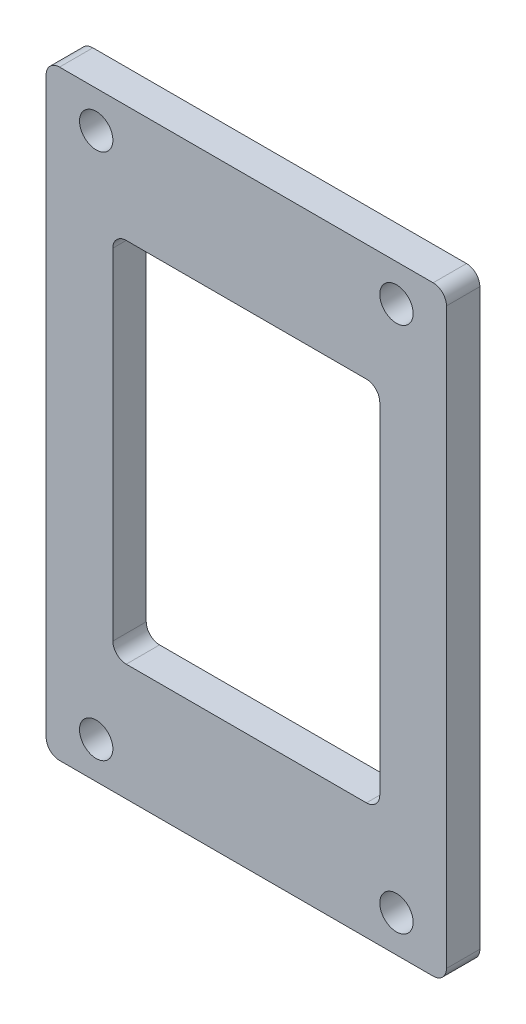
ISO-10303-21;
HEADER;
FILE_DESCRIPTION(('STEP AP214'),'2;1');
FILE_NAME('part.step','',(''),(''),'','','');
FILE_SCHEMA(('AUTOMOTIVE_DESIGN { 1 0 10303 214 1 1 1 1 }'));
ENDSEC;
DATA;
#1=APPLICATION_CONTEXT('core data for automotive mechanical design processes');
#2=APPLICATION_PROTOCOL_DEFINITION('international standard','automotive_design',2000,#1);
#3=PRODUCT_CONTEXT('',#1,'mechanical');
#4=PRODUCT('Part','Part','',(#3));
#5=PRODUCT_RELATED_PRODUCT_CATEGORY('part','',(#4));
#6=PRODUCT_DEFINITION_FORMATION('','',#4);
#7=PRODUCT_DEFINITION_CONTEXT('part definition',#1,'design');
#8=PRODUCT_DEFINITION('design','',#6,#7);
#9=PRODUCT_DEFINITION_SHAPE('','',#8);
#10=(LENGTH_UNIT() NAMED_UNIT(*) SI_UNIT(.MILLI.,.METRE.));
#11=(NAMED_UNIT(*) PLANE_ANGLE_UNIT() SI_UNIT($,.RADIAN.));
#12=(NAMED_UNIT(*) SI_UNIT($,.STERADIAN.) SOLID_ANGLE_UNIT());
#13=UNCERTAINTY_MEASURE_WITH_UNIT(LENGTH_MEASURE(1.E-05),#10,'distance_accuracy_value','');
#14=(GEOMETRIC_REPRESENTATION_CONTEXT(3) GLOBAL_UNCERTAINTY_ASSIGNED_CONTEXT((#13)) GLOBAL_UNIT_ASSIGNED_CONTEXT((#10,
#11,#12)) REPRESENTATION_CONTEXT('',''));
#15=CARTESIAN_POINT('',(0.,0.,0.));
#16=DIRECTION('',(0.,0.,1.));
#17=DIRECTION('',(1.,0.,0.));
#18=AXIS2_PLACEMENT_3D('',#15,#16,#17);
#19=CARTESIAN_POINT('',(-28.,-43.,5.));
#20=DIRECTION('',(0.,0.,-1.));
#21=DIRECTION('',(-1.,0.,0.));
#22=AXIS2_PLACEMENT_3D('',#19,#20,#21);
#23=CYLINDRICAL_SURFACE('',#22,2.);
#24=CARTESIAN_POINT('',(-28.,-43.,0.));
#25=DIRECTION('',(0.,0.,1.));
#26=DIRECTION('',(-1.,0.,0.));
#27=AXIS2_PLACEMENT_3D('',#24,#25,#26);
#28=CIRCLE('',#27,2.);
#29=CARTESIAN_POINT('',(-30.,-43.,0.));
#30=VERTEX_POINT('',#29);
#31=CARTESIAN_POINT('',(-28.,-45.,0.));
#32=VERTEX_POINT('',#31);
#33=EDGE_CURVE('E231',#30,#32,#28,.T.);
#34=ORIENTED_EDGE('',*,*,#33,.T.);
#35=DIRECTION('',(0.,0.,-1.));
#36=VECTOR('',#35,1.);
#37=CARTESIAN_POINT('',(-28.,-45.,5.));
#38=LINE('',#37,#36);
#39=CARTESIAN_POINT('',(-28.,-45.,5.));
#40=VERTEX_POINT('',#39);
#41=EDGE_CURVE('E11',#40,#32,#38,.T.);
#42=ORIENTED_EDGE('',*,*,#41,.F.);
#43=CARTESIAN_POINT('',(-28.,-43.,5.));
#44=DIRECTION('',(0.,0.,1.));
#45=DIRECTION('',(-1.,0.,0.));
#46=AXIS2_PLACEMENT_3D('',#43,#44,#45);
#47=CIRCLE('',#46,2.);
#48=CARTESIAN_POINT('',(-30.,-43.,5.));
#49=VERTEX_POINT('',#48);
#50=EDGE_CURVE('E249',#49,#40,#47,.T.);
#51=ORIENTED_EDGE('',*,*,#50,.F.);
#52=DIRECTION('',(0.,0.,-1.));
#53=VECTOR('',#52,1.);
#54=CARTESIAN_POINT('',(-30.,-43.,5.));
#55=LINE('',#54,#53);
#56=EDGE_CURVE('E275',#49,#30,#55,.T.);
#57=ORIENTED_EDGE('',*,*,#56,.T.);
#58=EDGE_LOOP('',(#34,#42,#51,#57));
#59=FACE_BOUND('',#58,.T.);
#60=ADVANCED_FACE('F39',(#59),#23,.T.);
#61=CARTESIAN_POINT('',(28.,-45.,5.));
#62=DIRECTION('',(0.,1.,0.));
#63=DIRECTION('',(-1.,0.,0.));
#64=AXIS2_PLACEMENT_3D('',#61,#62,#63);
#65=PLANE('',#64);
#66=DIRECTION('',(1.,0.,0.));
#67=VECTOR('',#66,1.);
#68=CARTESIAN_POINT('',(28.,-45.,0.));
#69=LINE('',#68,#67);
#70=CARTESIAN_POINT('',(28.,-45.,0.));
#71=VERTEX_POINT('',#70);
#72=EDGE_CURVE('E279',#32,#71,#69,.T.);
#73=ORIENTED_EDGE('',*,*,#72,.T.);
#74=DIRECTION('',(0.,0.,-1.));
#75=VECTOR('',#74,1.);
#76=CARTESIAN_POINT('',(28.,-45.,5.));
#77=LINE('',#76,#75);
#78=CARTESIAN_POINT('',(28.,-45.,5.));
#79=VERTEX_POINT('',#78);
#80=EDGE_CURVE('E47',#79,#71,#77,.T.);
#81=ORIENTED_EDGE('',*,*,#80,.F.);
#82=DIRECTION('',(1.,0.,0.));
#83=VECTOR('',#82,1.);
#84=CARTESIAN_POINT('',(28.,-45.,5.));
#85=LINE('',#84,#83);
#86=EDGE_CURVE('E253',#40,#79,#85,.T.);
#87=ORIENTED_EDGE('',*,*,#86,.F.);
#88=ORIENTED_EDGE('',*,*,#41,.T.);
#89=EDGE_LOOP('',(#73,#81,#87,#88));
#90=FACE_BOUND('',#89,.T.);
#91=ADVANCED_FACE('F348',(#90),#65,.F.);
#92=CARTESIAN_POINT('',(28.,-43.,5.));
#93=DIRECTION('',(0.,0.,-1.));
#94=DIRECTION('',(-1.,0.,0.));
#95=AXIS2_PLACEMENT_3D('',#92,#93,#94);
#96=CYLINDRICAL_SURFACE('',#95,2.00000000000001);
#97=CARTESIAN_POINT('',(28.,-43.,0.));
#98=DIRECTION('',(0.,0.,1.));
#99=DIRECTION('',(1.,0.,0.));
#100=AXIS2_PLACEMENT_3D('',#97,#98,#99);
#101=CIRCLE('',#100,2.00000000000001);
#102=CARTESIAN_POINT('',(30.,-43.,0.));
#103=VERTEX_POINT('',#102);
#104=EDGE_CURVE('E282',#71,#103,#101,.T.);
#105=ORIENTED_EDGE('',*,*,#104,.T.);
#106=DIRECTION('',(0.,0.,-1.));
#107=VECTOR('',#106,1.);
#108=CARTESIAN_POINT('',(30.,-43.,5.));
#109=LINE('',#108,#107);
#110=CARTESIAN_POINT('',(30.,-43.,5.));
#111=VERTEX_POINT('',#110);
#112=EDGE_CURVE('E318',#111,#103,#109,.T.);
#113=ORIENTED_EDGE('',*,*,#112,.F.);
#114=CARTESIAN_POINT('',(28.,-43.,5.));
#115=DIRECTION('',(0.,0.,1.));
#116=DIRECTION('',(1.,0.,0.));
#117=AXIS2_PLACEMENT_3D('',#114,#115,#116);
#118=CIRCLE('',#117,2.00000000000001);
#119=EDGE_CURVE('E257',#79,#111,#118,.T.);
#120=ORIENTED_EDGE('',*,*,#119,.F.);
#121=ORIENTED_EDGE('',*,*,#80,.T.);
#122=EDGE_LOOP('',(#105,#113,#120,#121));
#123=FACE_BOUND('',#122,.T.);
#124=ADVANCED_FACE('F327',(#123),#96,.T.);
#125=CARTESIAN_POINT('',(30.,-43.,5.));
#126=DIRECTION('',(-1.,0.,0.));
#127=DIRECTION('',(0.,-1.,0.));
#128=AXIS2_PLACEMENT_3D('',#125,#126,#127);
#129=PLANE('',#128);
#130=DIRECTION('',(0.,1.,0.));
#131=VECTOR('',#130,1.);
#132=CARTESIAN_POINT('',(30.,-43.,0.));
#133=LINE('',#132,#131);
#134=CARTESIAN_POINT('',(30.,43.,0.));
#135=VERTEX_POINT('',#134);
#136=EDGE_CURVE('E285',#103,#135,#133,.T.);
#137=ORIENTED_EDGE('',*,*,#136,.T.);
#138=DIRECTION('',(0.,0.,-1.));
#139=VECTOR('',#138,1.);
#140=CARTESIAN_POINT('',(30.,43.,5.));
#141=LINE('',#140,#139);
#142=CARTESIAN_POINT('',(30.,43.,5.));
#143=VERTEX_POINT('',#142);
#144=EDGE_CURVE('E314',#143,#135,#141,.T.);
#145=ORIENTED_EDGE('',*,*,#144,.F.);
#146=DIRECTION('',(0.,1.,0.));
#147=VECTOR('',#146,1.);
#148=CARTESIAN_POINT('',(30.,-43.,5.));
#149=LINE('',#148,#147);
#150=EDGE_CURVE('E260',#111,#143,#149,.T.);
#151=ORIENTED_EDGE('',*,*,#150,.F.);
#152=ORIENTED_EDGE('',*,*,#112,.T.);
#153=EDGE_LOOP('',(#137,#145,#151,#152));
#154=FACE_BOUND('',#153,.T.);
#155=ADVANCED_FACE('F338',(#154),#129,.F.);
#156=CARTESIAN_POINT('',(28.,43.,5.));
#157=DIRECTION('',(0.,0.,-1.));
#158=DIRECTION('',(-1.,0.,0.));
#159=AXIS2_PLACEMENT_3D('',#156,#157,#158);
#160=CYLINDRICAL_SURFACE('',#159,2.);
#161=CARTESIAN_POINT('',(28.,43.,0.));
#162=DIRECTION('',(0.,0.,1.));
#163=DIRECTION('',(1.,0.,0.));
#164=AXIS2_PLACEMENT_3D('',#161,#162,#163);
#165=CIRCLE('',#164,2.);
#166=CARTESIAN_POINT('',(28.,45.,0.));
#167=VERTEX_POINT('',#166);
#168=EDGE_CURVE('E288',#135,#167,#165,.T.);
#169=ORIENTED_EDGE('',*,*,#168,.T.);
#170=DIRECTION('',(0.,0.,-1.));
#171=VECTOR('',#170,1.);
#172=CARTESIAN_POINT('',(28.,45.,5.));
#173=LINE('',#172,#171);
#174=CARTESIAN_POINT('',(28.,45.,5.));
#175=VERTEX_POINT('',#174);
#176=EDGE_CURVE('E310',#175,#167,#173,.T.);
#177=ORIENTED_EDGE('',*,*,#176,.F.);
#178=CARTESIAN_POINT('',(28.,43.,5.));
#179=DIRECTION('',(0.,0.,1.));
#180=DIRECTION('',(1.,0.,0.));
#181=AXIS2_PLACEMENT_3D('',#178,#179,#180);
#182=CIRCLE('',#181,2.);
#183=EDGE_CURVE('E263',#143,#175,#182,.T.);
#184=ORIENTED_EDGE('',*,*,#183,.F.);
#185=ORIENTED_EDGE('',*,*,#144,.T.);
#186=EDGE_LOOP('',(#169,#177,#184,#185));
#187=FACE_BOUND('',#186,.T.);
#188=ADVANCED_FACE('F342',(#187),#160,.T.);
#189=CARTESIAN_POINT('',(28.,45.,5.));
#190=DIRECTION('',(0.,-1.,0.));
#191=DIRECTION('',(1.,0.,0.));
#192=AXIS2_PLACEMENT_3D('',#189,#190,#191);
#193=PLANE('',#192);
#194=DIRECTION('',(-1.,0.,0.));
#195=VECTOR('',#194,1.);
#196=CARTESIAN_POINT('',(28.,45.,0.));
#197=LINE('',#196,#195);
#198=CARTESIAN_POINT('',(-28.,45.,0.));
#199=VERTEX_POINT('',#198);
#200=EDGE_CURVE('E291',#167,#199,#197,.T.);
#201=ORIENTED_EDGE('',*,*,#200,.T.);
#202=DIRECTION('',(0.,0.,-1.));
#203=VECTOR('',#202,1.);
#204=CARTESIAN_POINT('',(-28.,45.,5.));
#205=LINE('',#204,#203);
#206=CARTESIAN_POINT('',(-28.,45.,5.));
#207=VERTEX_POINT('',#206);
#208=EDGE_CURVE('E306',#207,#199,#205,.T.);
#209=ORIENTED_EDGE('',*,*,#208,.F.);
#210=DIRECTION('',(-1.,0.,0.));
#211=VECTOR('',#210,1.);
#212=CARTESIAN_POINT('',(28.,45.,5.));
#213=LINE('',#212,#211);
#214=EDGE_CURVE('E266',#175,#207,#213,.T.);
#215=ORIENTED_EDGE('',*,*,#214,.F.);
#216=ORIENTED_EDGE('',*,*,#176,.T.);
#217=EDGE_LOOP('',(#201,#209,#215,#216));
#218=FACE_BOUND('',#217,.T.);
#219=ADVANCED_FACE('F361',(#218),#193,.F.);
#220=CARTESIAN_POINT('',(-28.,43.,5.));
#221=DIRECTION('',(0.,0.,-1.));
#222=DIRECTION('',(-1.,0.,0.));
#223=AXIS2_PLACEMENT_3D('',#220,#221,#222);
#224=CYLINDRICAL_SURFACE('',#223,1.99999999999999);
#225=CARTESIAN_POINT('',(-28.,43.,0.));
#226=DIRECTION('',(0.,0.,1.));
#227=DIRECTION('',(1.,0.,0.));
#228=AXIS2_PLACEMENT_3D('',#225,#226,#227);
#229=CIRCLE('',#228,1.99999999999999);
#230=CARTESIAN_POINT('',(-30.,43.,0.));
#231=VERTEX_POINT('',#230);
#232=EDGE_CURVE('E294',#199,#231,#229,.T.);
#233=ORIENTED_EDGE('',*,*,#232,.T.);
#234=DIRECTION('',(0.,0.,-1.));
#235=VECTOR('',#234,1.);
#236=CARTESIAN_POINT('',(-30.,43.,5.));
#237=LINE('',#236,#235);
#238=CARTESIAN_POINT('',(-30.,43.,5.));
#239=VERTEX_POINT('',#238);
#240=EDGE_CURVE('E302',#239,#231,#237,.T.);
#241=ORIENTED_EDGE('',*,*,#240,.F.);
#242=CARTESIAN_POINT('',(-28.,43.,5.));
#243=DIRECTION('',(0.,0.,1.));
#244=DIRECTION('',(1.,0.,0.));
#245=AXIS2_PLACEMENT_3D('',#242,#243,#244);
#246=CIRCLE('',#245,1.99999999999999);
#247=EDGE_CURVE('E269',#207,#239,#246,.T.);
#248=ORIENTED_EDGE('',*,*,#247,.F.);
#249=ORIENTED_EDGE('',*,*,#208,.T.);
#250=EDGE_LOOP('',(#233,#241,#248,#249));
#251=FACE_BOUND('',#250,.T.);
#252=ADVANCED_FACE('F359',(#251),#224,.T.);
#253=CARTESIAN_POINT('',(-30.,-43.,5.));
#254=DIRECTION('',(1.,0.,0.));
#255=DIRECTION('',(0.,1.,0.));
#256=AXIS2_PLACEMENT_3D('',#253,#254,#255);
#257=PLANE('',#256);
#258=DIRECTION('',(0.,-1.,0.));
#259=VECTOR('',#258,1.);
#260=CARTESIAN_POINT('',(-30.,-43.,0.));
#261=LINE('',#260,#259);
#262=EDGE_CURVE('E254',#231,#30,#261,.T.);
#263=ORIENTED_EDGE('',*,*,#262,.T.);
#264=ORIENTED_EDGE('',*,*,#56,.F.);
#265=DIRECTION('',(0.,-1.,0.));
#266=VECTOR('',#265,1.);
#267=CARTESIAN_POINT('',(-30.,-43.,5.));
#268=LINE('',#267,#266);
#269=EDGE_CURVE('E272',#239,#49,#268,.T.);
#270=ORIENTED_EDGE('',*,*,#269,.F.);
#271=ORIENTED_EDGE('',*,*,#240,.T.);
#272=EDGE_LOOP('',(#263,#264,#270,#271));
#273=FACE_BOUND('',#272,.T.);
#274=ADVANCED_FACE('F354',(#273),#257,.F.);
#275=CARTESIAN_POINT('',(-28.,-43.,5.));
#276=DIRECTION('',(0.,0.,-1.));
#277=DIRECTION('',(-1.,0.,0.));
#278=AXIS2_PLACEMENT_3D('',#275,#276,#277);
#279=PLANE('',#278);
#280=CARTESIAN_POINT('',(22.5000000000001,-39.5,5.));
#281=DIRECTION('',(0.,0.,1.));
#282=DIRECTION('',(1.,0.,0.));
#283=AXIS2_PLACEMENT_3D('',#280,#281,#282);
#284=CIRCLE('',#283,2.5);
#285=CARTESIAN_POINT('',(25.0000000000001,-39.5,5.));
#286=VERTEX_POINT('',#285);
#287=EDGE_CURVE('E549',#286,#286,#284,.T.);
#288=ORIENTED_EDGE('',*,*,#287,.F.);
#289=EDGE_LOOP('',(#288));
#290=FACE_BOUND('',#289,.T.);
#291=CARTESIAN_POINT('',(-22.5,39.5000000000002,5.));
#292=DIRECTION('',(0.,0.,1.));
#293=DIRECTION('',(1.,0.,0.));
#294=AXIS2_PLACEMENT_3D('',#291,#292,#293);
#295=CIRCLE('',#294,2.5);
#296=CARTESIAN_POINT('',(-20.,39.5000000000002,5.));
#297=VERTEX_POINT('',#296);
#298=EDGE_CURVE('E557',#297,#297,#295,.T.);
#299=ORIENTED_EDGE('',*,*,#298,.F.);
#300=EDGE_LOOP('',(#299));
#301=FACE_BOUND('',#300,.T.);
#302=CARTESIAN_POINT('',(22.5,39.5000000000002,5.));
#303=DIRECTION('',(0.,0.,1.));
#304=DIRECTION('',(1.,0.,0.));
#305=AXIS2_PLACEMENT_3D('',#302,#303,#304);
#306=CIRCLE('',#305,2.5);
#307=CARTESIAN_POINT('',(25.,39.5000000000002,5.));
#308=VERTEX_POINT('',#307);
#309=EDGE_CURVE('E588',#308,#308,#306,.T.);
#310=ORIENTED_EDGE('',*,*,#309,.F.);
#311=EDGE_LOOP('',(#310));
#312=FACE_BOUND('',#311,.T.);
#313=CARTESIAN_POINT('',(-22.5,-39.5,5.));
#314=DIRECTION('',(0.,0.,1.));
#315=DIRECTION('',(1.,0.,0.));
#316=AXIS2_PLACEMENT_3D('',#313,#314,#315);
#317=CIRCLE('',#316,2.5);
#318=CARTESIAN_POINT('',(-20.,-39.5,5.));
#319=VERTEX_POINT('',#318);
#320=EDGE_CURVE('E181',#319,#319,#317,.T.);
#321=ORIENTED_EDGE('',*,*,#320,.F.);
#322=EDGE_LOOP('',(#321));
#323=FACE_BOUND('',#322,.T.);
#324=DIRECTION('',(0.,-1.,0.));
#325=VECTOR('',#324,1.);
#326=CARTESIAN_POINT('',(20.,-25.5,5.));
#327=LINE('',#326,#325);
#328=CARTESIAN_POINT('',(20.,25.5,5.));
#329=VERTEX_POINT('',#328);
#330=CARTESIAN_POINT('',(20.,-25.5,5.));
#331=VERTEX_POINT('',#330);
#332=EDGE_CURVE('E161',#329,#331,#327,.T.);
#333=ORIENTED_EDGE('',*,*,#332,.T.);
#334=CARTESIAN_POINT('',(18.,-25.5,5.));
#335=DIRECTION('',(0.,0.,-1.));
#336=DIRECTION('',(1.,0.,0.));
#337=AXIS2_PLACEMENT_3D('',#334,#335,#336);
#338=CIRCLE('',#337,2.);
#339=CARTESIAN_POINT('',(18.,-27.5,5.));
#340=VERTEX_POINT('',#339);
#341=EDGE_CURVE('E154',#331,#340,#338,.T.);
#342=ORIENTED_EDGE('',*,*,#341,.T.);
#343=DIRECTION('',(-1.,0.,0.));
#344=VECTOR('',#343,1.);
#345=CARTESIAN_POINT('',(-18.,-27.5,5.));
#346=LINE('',#345,#344);
#347=CARTESIAN_POINT('',(-18.,-27.5,5.));
#348=VERTEX_POINT('',#347);
#349=EDGE_CURVE('E164',#340,#348,#346,.T.);
#350=ORIENTED_EDGE('',*,*,#349,.T.);
#351=CARTESIAN_POINT('',(-18.,-25.5,5.));
#352=DIRECTION('',(0.,0.,-1.));
#353=DIRECTION('',(-1.,0.,0.));
#354=AXIS2_PLACEMENT_3D('',#351,#352,#353);
#355=CIRCLE('',#354,2.);
#356=CARTESIAN_POINT('',(-20.,-25.5,5.));
#357=VERTEX_POINT('',#356);
#358=EDGE_CURVE('E54',#348,#357,#355,.T.);
#359=ORIENTED_EDGE('',*,*,#358,.T.);
#360=DIRECTION('',(0.,1.,0.));
#361=VECTOR('',#360,1.);
#362=CARTESIAN_POINT('',(-20.,-25.5,5.));
#363=LINE('',#362,#361);
#364=CARTESIAN_POINT('',(-20.,25.5,5.));
#365=VERTEX_POINT('',#364);
#366=EDGE_CURVE('E186',#357,#365,#363,.T.);
#367=ORIENTED_EDGE('',*,*,#366,.T.);
#368=CARTESIAN_POINT('',(-18.,25.5,5.));
#369=DIRECTION('',(0.,0.,-1.));
#370=DIRECTION('',(-1.,0.,0.));
#371=AXIS2_PLACEMENT_3D('',#368,#369,#370);
#372=CIRCLE('',#371,2.);
#373=CARTESIAN_POINT('',(-18.,27.5,5.));
#374=VERTEX_POINT('',#373);
#375=EDGE_CURVE('E190',#365,#374,#372,.T.);
#376=ORIENTED_EDGE('',*,*,#375,.T.);
#377=DIRECTION('',(1.,0.,0.));
#378=VECTOR('',#377,1.);
#379=CARTESIAN_POINT('',(-18.,27.5,5.));
#380=LINE('',#379,#378);
#381=CARTESIAN_POINT('',(18.,27.5,5.));
#382=VERTEX_POINT('',#381);
#383=EDGE_CURVE('E194',#374,#382,#380,.T.);
#384=ORIENTED_EDGE('',*,*,#383,.T.);
#385=CARTESIAN_POINT('',(18.,25.5,5.));
#386=DIRECTION('',(0.,0.,-1.));
#387=DIRECTION('',(-1.,0.,0.));
#388=AXIS2_PLACEMENT_3D('',#385,#386,#387);
#389=CIRCLE('',#388,2.);
#390=EDGE_CURVE('E198',#382,#329,#389,.T.);
#391=ORIENTED_EDGE('',*,*,#390,.T.);
#392=EDGE_LOOP('',(#333,#342,#350,#359,#367,#376,#384,#391));
#393=FACE_BOUND('',#392,.T.);
#394=ORIENTED_EDGE('',*,*,#50,.T.);
#395=ORIENTED_EDGE('',*,*,#86,.T.);
#396=ORIENTED_EDGE('',*,*,#119,.T.);
#397=ORIENTED_EDGE('',*,*,#150,.T.);
#398=ORIENTED_EDGE('',*,*,#183,.T.);
#399=ORIENTED_EDGE('',*,*,#214,.T.);
#400=ORIENTED_EDGE('',*,*,#247,.T.);
#401=ORIENTED_EDGE('',*,*,#269,.T.);
#402=EDGE_LOOP('',(#394,#395,#396,#397,#398,#399,#400,#401));
#403=FACE_BOUND('',#402,.T.);
#404=ADVANCED_FACE('F169',(#290,#301,#312,#323,#393,#403),#279,.F.);
#405=CARTESIAN_POINT('',(-28.,-43.,0.));
#406=DIRECTION('',(0.,0.,-1.));
#407=DIRECTION('',(-1.,0.,0.));
#408=AXIS2_PLACEMENT_3D('',#405,#406,#407);
#409=PLANE('',#408);
#410=CARTESIAN_POINT('',(22.5000000000001,-39.5,0.));
#411=DIRECTION('',(0.,0.,1.));
#412=DIRECTION('',(1.,0.,0.));
#413=AXIS2_PLACEMENT_3D('',#410,#411,#412);
#414=CIRCLE('',#413,2.5);
#415=CARTESIAN_POINT('',(25.0000000000001,-39.5,0.));
#416=VERTEX_POINT('',#415);
#417=EDGE_CURVE('E546',#416,#416,#414,.T.);
#418=ORIENTED_EDGE('',*,*,#417,.T.);
#419=EDGE_LOOP('',(#418));
#420=FACE_BOUND('',#419,.T.);
#421=CARTESIAN_POINT('',(-22.5,39.5000000000002,0.));
#422=DIRECTION('',(0.,0.,1.));
#423=DIRECTION('',(1.,0.,0.));
#424=AXIS2_PLACEMENT_3D('',#421,#422,#423);
#425=CIRCLE('',#424,2.5);
#426=CARTESIAN_POINT('',(-20.,39.5000000000002,0.));
#427=VERTEX_POINT('',#426);
#428=EDGE_CURVE('E551',#427,#427,#425,.T.);
#429=ORIENTED_EDGE('',*,*,#428,.T.);
#430=EDGE_LOOP('',(#429));
#431=FACE_BOUND('',#430,.T.);
#432=CARTESIAN_POINT('',(22.5,39.5000000000002,0.));
#433=DIRECTION('',(0.,0.,1.));
#434=DIRECTION('',(1.,0.,0.));
#435=AXIS2_PLACEMENT_3D('',#432,#433,#434);
#436=CIRCLE('',#435,2.5);
#437=CARTESIAN_POINT('',(25.,39.5000000000002,0.));
#438=VERTEX_POINT('',#437);
#439=EDGE_CURVE('E563',#438,#438,#436,.T.);
#440=ORIENTED_EDGE('',*,*,#439,.T.);
#441=EDGE_LOOP('',(#440));
#442=FACE_BOUND('',#441,.T.);
#443=CARTESIAN_POINT('',(-22.5,-39.5,0.));
#444=DIRECTION('',(0.,0.,1.));
#445=DIRECTION('',(1.,0.,0.));
#446=AXIS2_PLACEMENT_3D('',#443,#444,#445);
#447=CIRCLE('',#446,2.5);
#448=CARTESIAN_POINT('',(-20.,-39.5,0.));
#449=VERTEX_POINT('',#448);
#450=EDGE_CURVE('E206',#449,#449,#447,.T.);
#451=ORIENTED_EDGE('',*,*,#450,.T.);
#452=EDGE_LOOP('',(#451));
#453=FACE_BOUND('',#452,.T.);
#454=CARTESIAN_POINT('',(18.,-25.5,0.));
#455=DIRECTION('',(0.,0.,-1.));
#456=DIRECTION('',(1.,0.,0.));
#457=AXIS2_PLACEMENT_3D('',#454,#455,#456);
#458=CIRCLE('',#457,2.);
#459=CARTESIAN_POINT('',(20.,-25.5,0.));
#460=VERTEX_POINT('',#459);
#461=CARTESIAN_POINT('',(18.,-27.5,0.));
#462=VERTEX_POINT('',#461);
#463=EDGE_CURVE('E62',#460,#462,#458,.T.);
#464=ORIENTED_EDGE('',*,*,#463,.F.);
#465=DIRECTION('',(0.,-1.,0.));
#466=VECTOR('',#465,1.);
#467=CARTESIAN_POINT('',(20.,-25.5,0.));
#468=LINE('',#467,#466);
#469=CARTESIAN_POINT('',(20.,25.5,0.));
#470=VERTEX_POINT('',#469);
#471=EDGE_CURVE('E174',#470,#460,#468,.T.);
#472=ORIENTED_EDGE('',*,*,#471,.F.);
#473=CARTESIAN_POINT('',(18.,25.5,0.));
#474=DIRECTION('',(0.,0.,-1.));
#475=DIRECTION('',(-1.,0.,0.));
#476=AXIS2_PLACEMENT_3D('',#473,#474,#475);
#477=CIRCLE('',#476,2.);
#478=CARTESIAN_POINT('',(18.,27.5,0.));
#479=VERTEX_POINT('',#478);
#480=EDGE_CURVE('E178',#479,#470,#477,.T.);
#481=ORIENTED_EDGE('',*,*,#480,.F.);
#482=DIRECTION('',(1.,0.,0.));
#483=VECTOR('',#482,1.);
#484=CARTESIAN_POINT('',(-18.,27.5,0.));
#485=LINE('',#484,#483);
#486=CARTESIAN_POINT('',(-18.,27.5,0.));
#487=VERTEX_POINT('',#486);
#488=EDGE_CURVE('E221',#487,#479,#485,.T.);
#489=ORIENTED_EDGE('',*,*,#488,.F.);
#490=CARTESIAN_POINT('',(-18.,25.5,0.));
#491=DIRECTION('',(0.,0.,-1.));
#492=DIRECTION('',(-1.,0.,0.));
#493=AXIS2_PLACEMENT_3D('',#490,#491,#492);
#494=CIRCLE('',#493,2.);
#495=CARTESIAN_POINT('',(-20.,25.5,0.));
#496=VERTEX_POINT('',#495);
#497=EDGE_CURVE('E217',#496,#487,#494,.T.);
#498=ORIENTED_EDGE('',*,*,#497,.F.);
#499=DIRECTION('',(0.,1.,0.));
#500=VECTOR('',#499,1.);
#501=CARTESIAN_POINT('',(-20.,-25.5,0.));
#502=LINE('',#501,#500);
#503=CARTESIAN_POINT('',(-20.,-25.5,0.));
#504=VERTEX_POINT('',#503);
#505=EDGE_CURVE('E213',#504,#496,#502,.T.);
#506=ORIENTED_EDGE('',*,*,#505,.F.);
#507=CARTESIAN_POINT('',(-18.,-25.5,0.));
#508=DIRECTION('',(0.,0.,-1.));
#509=DIRECTION('',(-1.,0.,0.));
#510=AXIS2_PLACEMENT_3D('',#507,#508,#509);
#511=CIRCLE('',#510,2.);
#512=CARTESIAN_POINT('',(-18.,-27.5,0.));
#513=VERTEX_POINT('',#512);
#514=EDGE_CURVE('E209',#513,#504,#511,.T.);
#515=ORIENTED_EDGE('',*,*,#514,.F.);
#516=DIRECTION('',(-1.,0.,0.));
#517=VECTOR('',#516,1.);
#518=CARTESIAN_POINT('',(-18.,-27.5,0.));
#519=LINE('',#518,#517);
#520=EDGE_CURVE('E205',#462,#513,#519,.T.);
#521=ORIENTED_EDGE('',*,*,#520,.F.);
#522=EDGE_LOOP('',(#464,#472,#481,#489,#498,#506,#515,#521));
#523=FACE_BOUND('',#522,.T.);
#524=ORIENTED_EDGE('',*,*,#33,.F.);
#525=ORIENTED_EDGE('',*,*,#262,.F.);
#526=ORIENTED_EDGE('',*,*,#232,.F.);
#527=ORIENTED_EDGE('',*,*,#200,.F.);
#528=ORIENTED_EDGE('',*,*,#168,.F.);
#529=ORIENTED_EDGE('',*,*,#136,.F.);
#530=ORIENTED_EDGE('',*,*,#104,.F.);
#531=ORIENTED_EDGE('',*,*,#72,.F.);
#532=EDGE_LOOP('',(#524,#525,#526,#527,#528,#529,#530,#531));
#533=FACE_BOUND('',#532,.T.);
#534=ADVANCED_FACE('F333',(#420,#431,#442,#453,#523,#533),#409,.T.);
#535=CARTESIAN_POINT('',(18.,-25.5,5.));
#536=DIRECTION('',(0.,0.,-1.));
#537=DIRECTION('',(-1.,0.,0.));
#538=AXIS2_PLACEMENT_3D('',#535,#536,#537);
#539=CYLINDRICAL_SURFACE('',#538,2.);
#540=ORIENTED_EDGE('',*,*,#463,.T.);
#541=DIRECTION('',(0.,0.,-1.));
#542=VECTOR('',#541,1.);
#543=CARTESIAN_POINT('',(18.,-27.5,5.));
#544=LINE('',#543,#542);
#545=EDGE_CURVE('E150',#340,#462,#544,.T.);
#546=ORIENTED_EDGE('',*,*,#545,.F.);
#547=ORIENTED_EDGE('',*,*,#341,.F.);
#548=DIRECTION('',(0.,0.,-1.));
#549=VECTOR('',#548,1.);
#550=CARTESIAN_POINT('',(20.,-25.5,5.));
#551=LINE('',#550,#549);
#552=EDGE_CURVE('E228',#331,#460,#551,.T.);
#553=ORIENTED_EDGE('',*,*,#552,.T.);
#554=EDGE_LOOP('',(#540,#546,#547,#553));
#555=FACE_BOUND('',#554,.T.);
#556=ADVANCED_FACE('F152',(#555),#539,.F.);
#557=CARTESIAN_POINT('',(20.,-25.5,5.));
#558=DIRECTION('',(1.,0.,0.));
#559=DIRECTION('',(0.,0.,-1.));
#560=AXIS2_PLACEMENT_3D('',#557,#558,#559);
#561=PLANE('',#560);
#562=ORIENTED_EDGE('',*,*,#471,.T.);
#563=ORIENTED_EDGE('',*,*,#552,.F.);
#564=ORIENTED_EDGE('',*,*,#332,.F.);
#565=DIRECTION('',(0.,0.,-1.));
#566=VECTOR('',#565,1.);
#567=CARTESIAN_POINT('',(20.,25.5,5.));
#568=LINE('',#567,#566);
#569=EDGE_CURVE('E232',#329,#470,#568,.T.);
#570=ORIENTED_EDGE('',*,*,#569,.T.);
#571=EDGE_LOOP('',(#562,#563,#564,#570));
#572=FACE_BOUND('',#571,.T.);
#573=ADVANCED_FACE('F417',(#572),#561,.F.);
#574=CARTESIAN_POINT('',(18.,25.5,5.));
#575=DIRECTION('',(0.,0.,-1.));
#576=DIRECTION('',(-1.,0.,0.));
#577=AXIS2_PLACEMENT_3D('',#574,#575,#576);
#578=CYLINDRICAL_SURFACE('',#577,2.);
#579=ORIENTED_EDGE('',*,*,#480,.T.);
#580=ORIENTED_EDGE('',*,*,#569,.F.);
#581=ORIENTED_EDGE('',*,*,#390,.F.);
#582=DIRECTION('',(0.,0.,-1.));
#583=VECTOR('',#582,1.);
#584=CARTESIAN_POINT('',(18.,27.5,5.));
#585=LINE('',#584,#583);
#586=EDGE_CURVE('E235',#382,#479,#585,.T.);
#587=ORIENTED_EDGE('',*,*,#586,.T.);
#588=EDGE_LOOP('',(#579,#580,#581,#587));
#589=FACE_BOUND('',#588,.T.);
#590=ADVANCED_FACE('F428',(#589),#578,.F.);
#591=CARTESIAN_POINT('',(-18.,27.5,5.));
#592=DIRECTION('',(0.,1.,0.));
#593=DIRECTION('',(-1.,0.,0.));
#594=AXIS2_PLACEMENT_3D('',#591,#592,#593);
#595=PLANE('',#594);
#596=ORIENTED_EDGE('',*,*,#488,.T.);
#597=ORIENTED_EDGE('',*,*,#586,.F.);
#598=ORIENTED_EDGE('',*,*,#383,.F.);
#599=DIRECTION('',(0.,0.,-1.));
#600=VECTOR('',#599,1.);
#601=CARTESIAN_POINT('',(-18.,27.5,5.));
#602=LINE('',#601,#600);
#603=EDGE_CURVE('E238',#374,#487,#602,.T.);
#604=ORIENTED_EDGE('',*,*,#603,.T.);
#605=EDGE_LOOP('',(#596,#597,#598,#604));
#606=FACE_BOUND('',#605,.T.);
#607=ADVANCED_FACE('F438',(#606),#595,.F.);
#608=CARTESIAN_POINT('',(-18.,25.5,5.));
#609=DIRECTION('',(0.,0.,-1.));
#610=DIRECTION('',(-1.,0.,0.));
#611=AXIS2_PLACEMENT_3D('',#608,#609,#610);
#612=CYLINDRICAL_SURFACE('',#611,2.);
#613=ORIENTED_EDGE('',*,*,#497,.T.);
#614=ORIENTED_EDGE('',*,*,#603,.F.);
#615=ORIENTED_EDGE('',*,*,#375,.F.);
#616=DIRECTION('',(0.,0.,-1.));
#617=VECTOR('',#616,1.);
#618=CARTESIAN_POINT('',(-20.,25.5,5.));
#619=LINE('',#618,#617);
#620=EDGE_CURVE('E241',#365,#496,#619,.T.);
#621=ORIENTED_EDGE('',*,*,#620,.T.);
#622=EDGE_LOOP('',(#613,#614,#615,#621));
#623=FACE_BOUND('',#622,.T.);
#624=ADVANCED_FACE('F448',(#623),#612,.F.);
#625=CARTESIAN_POINT('',(-20.,-25.5,5.));
#626=DIRECTION('',(-1.,0.,0.));
#627=DIRECTION('',(0.,-1.,0.));
#628=AXIS2_PLACEMENT_3D('',#625,#626,#627);
#629=PLANE('',#628);
#630=ORIENTED_EDGE('',*,*,#505,.T.);
#631=ORIENTED_EDGE('',*,*,#620,.F.);
#632=ORIENTED_EDGE('',*,*,#366,.F.);
#633=DIRECTION('',(0.,0.,-1.));
#634=VECTOR('',#633,1.);
#635=CARTESIAN_POINT('',(-20.,-25.5,5.));
#636=LINE('',#635,#634);
#637=EDGE_CURVE('E244',#357,#504,#636,.T.);
#638=ORIENTED_EDGE('',*,*,#637,.T.);
#639=EDGE_LOOP('',(#630,#631,#632,#638));
#640=FACE_BOUND('',#639,.T.);
#641=ADVANCED_FACE('F458',(#640),#629,.F.);
#642=CARTESIAN_POINT('',(-18.,-25.5,5.));
#643=DIRECTION('',(0.,0.,-1.));
#644=DIRECTION('',(-1.,0.,0.));
#645=AXIS2_PLACEMENT_3D('',#642,#643,#644);
#646=CYLINDRICAL_SURFACE('',#645,2.);
#647=ORIENTED_EDGE('',*,*,#514,.T.);
#648=ORIENTED_EDGE('',*,*,#637,.F.);
#649=ORIENTED_EDGE('',*,*,#358,.F.);
#650=DIRECTION('',(0.,0.,-1.));
#651=VECTOR('',#650,1.);
#652=CARTESIAN_POINT('',(-18.,-27.5,5.));
#653=LINE('',#652,#651);
#654=EDGE_CURVE('E160',#348,#513,#653,.T.);
#655=ORIENTED_EDGE('',*,*,#654,.T.);
#656=EDGE_LOOP('',(#647,#648,#649,#655));
#657=FACE_BOUND('',#656,.T.);
#658=ADVANCED_FACE('F468',(#657),#646,.F.);
#659=CARTESIAN_POINT('',(-18.,-27.5,5.));
#660=DIRECTION('',(0.,-1.,0.));
#661=DIRECTION('',(1.,0.,0.));
#662=AXIS2_PLACEMENT_3D('',#659,#660,#661);
#663=PLANE('',#662);
#664=ORIENTED_EDGE('',*,*,#520,.T.);
#665=ORIENTED_EDGE('',*,*,#654,.F.);
#666=ORIENTED_EDGE('',*,*,#349,.F.);
#667=ORIENTED_EDGE('',*,*,#545,.T.);
#668=EDGE_LOOP('',(#664,#665,#666,#667));
#669=FACE_BOUND('',#668,.T.);
#670=ADVANCED_FACE('F165',(#669),#663,.F.);
#671=CARTESIAN_POINT('',(-22.5,-39.5,0.));
#672=DIRECTION('',(0.,0.,1.));
#673=DIRECTION('',(1.,0.,0.));
#674=AXIS2_PLACEMENT_3D('',#671,#672,#673);
#675=CYLINDRICAL_SURFACE('',#674,2.5);
#676=ORIENTED_EDGE('',*,*,#450,.F.);
#677=EDGE_LOOP('',(#676));
#678=FACE_BOUND('',#677,.T.);
#679=ORIENTED_EDGE('',*,*,#320,.T.);
#680=EDGE_LOOP('',(#679));
#681=FACE_BOUND('',#680,.T.);
#682=ADVANCED_FACE('F486',(#678,#681),#675,.F.);
#683=CARTESIAN_POINT('',(22.5,39.5000000000002,0.));
#684=DIRECTION('',(0.,0.,1.));
#685=DIRECTION('',(1.,0.,0.));
#686=AXIS2_PLACEMENT_3D('',#683,#684,#685);
#687=CYLINDRICAL_SURFACE('',#686,2.5);
#688=ORIENTED_EDGE('',*,*,#439,.F.);
#689=EDGE_LOOP('',(#688));
#690=FACE_BOUND('',#689,.T.);
#691=ORIENTED_EDGE('',*,*,#309,.T.);
#692=EDGE_LOOP('',(#691));
#693=FACE_BOUND('',#692,.T.);
#694=ADVANCED_FACE('F509',(#690,#693),#687,.F.);
#695=CARTESIAN_POINT('',(-22.5,39.5000000000002,0.));
#696=DIRECTION('',(0.,0.,1.));
#697=DIRECTION('',(1.,0.,0.));
#698=AXIS2_PLACEMENT_3D('',#695,#696,#697);
#699=CYLINDRICAL_SURFACE('',#698,2.5);
#700=ORIENTED_EDGE('',*,*,#428,.F.);
#701=EDGE_LOOP('',(#700));
#702=FACE_BOUND('',#701,.T.);
#703=ORIENTED_EDGE('',*,*,#298,.T.);
#704=EDGE_LOOP('',(#703));
#705=FACE_BOUND('',#704,.T.);
#706=ADVANCED_FACE('F519',(#702,#705),#699,.F.);
#707=CARTESIAN_POINT('',(22.5000000000001,-39.5,0.));
#708=DIRECTION('',(0.,0.,1.));
#709=DIRECTION('',(1.,0.,0.));
#710=AXIS2_PLACEMENT_3D('',#707,#708,#709);
#711=CYLINDRICAL_SURFACE('',#710,2.5);
#712=ORIENTED_EDGE('',*,*,#417,.F.);
#713=EDGE_LOOP('',(#712));
#714=FACE_BOUND('',#713,.T.);
#715=ORIENTED_EDGE('',*,*,#287,.T.);
#716=EDGE_LOOP('',(#715));
#717=FACE_BOUND('',#716,.T.);
#718=ADVANCED_FACE('F529',(#714,#717),#711,.F.);
#719=CLOSED_SHELL('',(#60,#91,#124,#155,#188,#219,#252,#274,#404,#534,#556,#573,#590,#607,#624,
#641,#658,#670,#682,#694,#706,#718));
#720=MANIFOLD_SOLID_BREP('B2',#719);
#721=ADVANCED_BREP_SHAPE_REPRESENTATION('',(#18,#720),#14);
#722=SHAPE_DEFINITION_REPRESENTATION(#9,#721);
ENDSEC;
END-ISO-10303-21;
